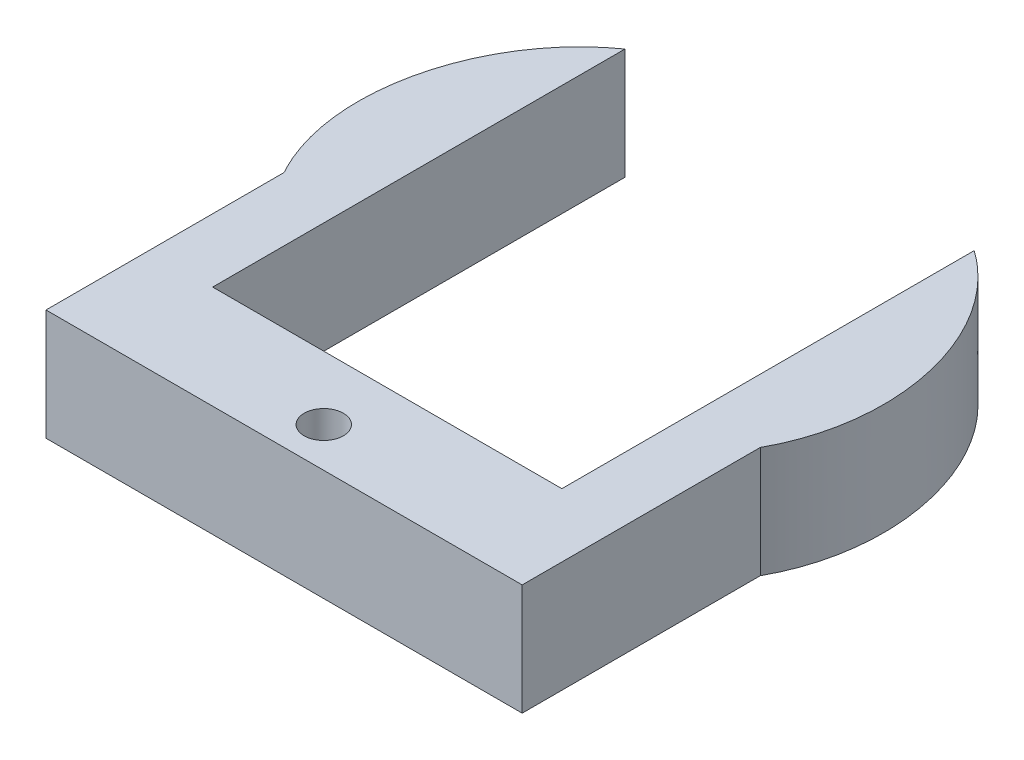
ISO-10303-21;
HEADER;
FILE_DESCRIPTION(('STEP AP214'),'2;1');
FILE_NAME('part.step','',(''),(''),'','','');
FILE_SCHEMA(('AUTOMOTIVE_DESIGN { 1 0 10303 214 1 1 1 1 }'));
ENDSEC;
DATA;
#1=APPLICATION_CONTEXT('core data for automotive mechanical design processes');
#2=APPLICATION_PROTOCOL_DEFINITION('international standard','automotive_design',2000,#1);
#3=PRODUCT_CONTEXT('',#1,'mechanical');
#4=PRODUCT('Part','Part','',(#3));
#5=PRODUCT_RELATED_PRODUCT_CATEGORY('part','',(#4));
#6=PRODUCT_DEFINITION_FORMATION('','',#4);
#7=PRODUCT_DEFINITION_CONTEXT('part definition',#1,'design');
#8=PRODUCT_DEFINITION('design','',#6,#7);
#9=PRODUCT_DEFINITION_SHAPE('','',#8);
#10=(LENGTH_UNIT() NAMED_UNIT(*) SI_UNIT(.MILLI.,.METRE.));
#11=(NAMED_UNIT(*) PLANE_ANGLE_UNIT() SI_UNIT($,.RADIAN.));
#12=(NAMED_UNIT(*) SI_UNIT($,.STERADIAN.) SOLID_ANGLE_UNIT());
#13=UNCERTAINTY_MEASURE_WITH_UNIT(LENGTH_MEASURE(1.E-05),#10,'distance_accuracy_value','');
#14=(GEOMETRIC_REPRESENTATION_CONTEXT(3) GLOBAL_UNCERTAINTY_ASSIGNED_CONTEXT((#13)) GLOBAL_UNIT_ASSIGNED_CONTEXT((#10,
#11,#12)) REPRESENTATION_CONTEXT('',''));
#15=CARTESIAN_POINT('',(0.,0.,0.));
#16=DIRECTION('',(0.,0.,1.));
#17=DIRECTION('',(1.,0.,0.));
#18=AXIS2_PLACEMENT_3D('',#15,#16,#17);
#19=CARTESIAN_POINT('',(0.,14.,-14.9999999999999));
#20=DIRECTION('',(0.,0.,-1.));
#21=DIRECTION('',(-1.,0.,0.));
#22=AXIS2_PLACEMENT_3D('',#19,#20,#21);
#23=PLANE('',#22);
#24=DIRECTION('',(1.,0.,0.));
#25=VECTOR('',#24,1.);
#26=CARTESIAN_POINT('',(0.,0.,-14.9999999999999));
#27=LINE('',#26,#25);
#28=CARTESIAN_POINT('',(0.,0.,-14.9999999999999));
#29=VERTEX_POINT('',#28);
#30=CARTESIAN_POINT('',(60.,0.,-14.9999999999999));
#31=VERTEX_POINT('',#30);
#32=EDGE_CURVE('E192',#29,#31,#27,.T.);
#33=ORIENTED_EDGE('',*,*,#32,.T.);
#34=DIRECTION('',(0.,-1.,0.));
#35=VECTOR('',#34,1.);
#36=CARTESIAN_POINT('',(60.,14.,-14.9999999999999));
#37=LINE('',#36,#35);
#38=CARTESIAN_POINT('',(60.,14.,-14.9999999999999));
#39=VERTEX_POINT('',#38);
#40=EDGE_CURVE('E11',#39,#31,#37,.T.);
#41=ORIENTED_EDGE('',*,*,#40,.F.);
#42=DIRECTION('',(1.,0.,0.));
#43=VECTOR('',#42,1.);
#44=CARTESIAN_POINT('',(0.,14.,-14.9999999999999));
#45=LINE('',#44,#43);
#46=CARTESIAN_POINT('',(0.,14.,-14.9999999999999));
#47=VERTEX_POINT('',#46);
#48=EDGE_CURVE('E209',#47,#39,#45,.T.);
#49=ORIENTED_EDGE('',*,*,#48,.F.);
#50=DIRECTION('',(0.,-1.,0.));
#51=VECTOR('',#50,1.);
#52=CARTESIAN_POINT('',(0.,14.,-14.9999999999999));
#53=LINE('',#52,#51);
#54=EDGE_CURVE('E124',#47,#29,#53,.T.);
#55=ORIENTED_EDGE('',*,*,#54,.T.);
#56=EDGE_LOOP('',(#33,#41,#49,#55));
#57=FACE_BOUND('',#56,.T.);
#58=ADVANCED_FACE('F33',(#57),#23,.F.);
#59=CARTESIAN_POINT('',(60.,14.,-14.9999999999999));
#60=DIRECTION('',(-1.,0.,0.));
#61=DIRECTION('',(0.,0.,1.));
#62=AXIS2_PLACEMENT_3D('',#59,#60,#61);
#63=PLANE('',#62);
#64=DIRECTION('',(0.,0.,-1.));
#65=VECTOR('',#64,1.);
#66=CARTESIAN_POINT('',(60.,0.,-14.9999999999999));
#67=LINE('',#66,#65);
#68=CARTESIAN_POINT('',(60.,0.,-45.));
#69=VERTEX_POINT('',#68);
#70=EDGE_CURVE('E189',#31,#69,#67,.T.);
#71=ORIENTED_EDGE('',*,*,#70,.T.);
#72=DIRECTION('',(0.,-1.,0.));
#73=VECTOR('',#72,1.);
#74=CARTESIAN_POINT('',(60.,14.,-45.));
#75=LINE('',#74,#73);
#76=CARTESIAN_POINT('',(60.,14.,-45.));
#77=VERTEX_POINT('',#76);
#78=EDGE_CURVE('E41',#77,#69,#75,.T.);
#79=ORIENTED_EDGE('',*,*,#78,.F.);
#80=DIRECTION('',(0.,0.,-1.));
#81=VECTOR('',#80,1.);
#82=CARTESIAN_POINT('',(60.,14.,-14.9999999999999));
#83=LINE('',#82,#81);
#84=EDGE_CURVE('E92',#39,#77,#83,.T.);
#85=ORIENTED_EDGE('',*,*,#84,.F.);
#86=ORIENTED_EDGE('',*,*,#40,.T.);
#87=EDGE_LOOP('',(#71,#79,#85,#86));
#88=FACE_BOUND('',#87,.T.);
#89=ADVANCED_FACE('F153',(#88),#63,.F.);
#90=CARTESIAN_POINT('',(60.,14.,-45.));
#91=CARTESIAN_POINT('',(64.2674134117202,14.,-52.7021578491893));
#92=CARTESIAN_POINT('',(63.8497104287764,14.,-67.2321104164456));
#93=CARTESIAN_POINT('',(55.427779911578,14.,-77.5248648328304));
#94=CARTESIAN_POINT('',(51.9999999999951,14.,-79.9540570080804));
#95=B_SPLINE_CURVE_WITH_KNOTS('',3,(#90,#91,#92,#93,#94),.UNSPECIFIED.,.F.,.F.,(4,1,4),(0.,
0.616858972813257,0.907352470321946),.UNSPECIFIED.);
#96=DIRECTION('',(0.,-1.,0.));
#97=VECTOR('',#96,1.);
#98=SURFACE_OF_LINEAR_EXTRUSION('',#95,#97);
#99=CARTESIAN_POINT('',(60.,0.,-45.));
#100=CARTESIAN_POINT('',(64.2674134117202,0.,-52.7021578491893));
#101=CARTESIAN_POINT('',(63.8497104287764,0.,-67.2321104164456));
#102=CARTESIAN_POINT('',(55.427779911578,0.,-77.5248648328304));
#103=CARTESIAN_POINT('',(51.9999999999951,0.,-79.9540570080804));
#104=B_SPLINE_CURVE_WITH_KNOTS('',3,(#99,#100,#101,#102,#103),.UNSPECIFIED.,.F.,.F.,(4,1,4),(0.,
0.616858972813257,0.907352470321946),.UNSPECIFIED.);
#105=CARTESIAN_POINT('',(51.999999999995,0.,-79.9540570080804));
#106=VERTEX_POINT('',#105);
#107=EDGE_CURVE('E185',#69,#106,#104,.T.);
#108=ORIENTED_EDGE('',*,*,#107,.T.);
#109=DIRECTION('',(0.,-1.,0.));
#110=VECTOR('',#109,1.);
#111=CARTESIAN_POINT('',(51.999999999995,14.,-79.9540570080804));
#112=LINE('',#111,#110);
#113=CARTESIAN_POINT('',(51.999999999995,14.,-79.9540570080804));
#114=VERTEX_POINT('',#113);
#115=EDGE_CURVE('E176',#114,#106,#112,.T.);
#116=ORIENTED_EDGE('',*,*,#115,.F.);
#117=EDGE_CURVE('E155',#77,#114,#95,.T.);
#118=ORIENTED_EDGE('',*,*,#117,.F.);
#119=ORIENTED_EDGE('',*,*,#78,.T.);
#120=EDGE_LOOP('',(#108,#116,#118,#119));
#121=FACE_BOUND('',#120,.T.);
#122=ADVANCED_FACE('F149',(#121),#98,.F.);
#123=CARTESIAN_POINT('',(51.999999999995,14.,-28.));
#124=DIRECTION('',(1.,0.,0.));
#125=DIRECTION('',(0.,0.,-1.));
#126=AXIS2_PLACEMENT_3D('',#123,#124,#125);
#127=PLANE('',#126);
#128=DIRECTION('',(0.,0.,1.));
#129=VECTOR('',#128,1.);
#130=CARTESIAN_POINT('',(51.999999999995,0.,-28.));
#131=LINE('',#130,#129);
#132=CARTESIAN_POINT('',(51.999999999995,0.,-28.));
#133=VERTEX_POINT('',#132);
#134=EDGE_CURVE('E173',#106,#133,#131,.T.);
#135=ORIENTED_EDGE('',*,*,#134,.T.);
#136=DIRECTION('',(0.,-1.,0.));
#137=VECTOR('',#136,1.);
#138=CARTESIAN_POINT('',(51.999999999995,14.,-28.));
#139=LINE('',#138,#137);
#140=CARTESIAN_POINT('',(51.999999999995,14.,-28.));
#141=VERTEX_POINT('',#140);
#142=EDGE_CURVE('E172',#141,#133,#139,.T.);
#143=ORIENTED_EDGE('',*,*,#142,.F.);
#144=DIRECTION('',(0.,0.,1.));
#145=VECTOR('',#144,1.);
#146=CARTESIAN_POINT('',(51.999999999995,14.,-70.29729534041));
#147=LINE('',#146,#145);
#148=EDGE_CURVE('E161',#114,#141,#147,.T.);
#149=ORIENTED_EDGE('',*,*,#148,.F.);
#150=ORIENTED_EDGE('',*,*,#115,.T.);
#151=EDGE_LOOP('',(#135,#143,#149,#150));
#152=FACE_BOUND('',#151,.T.);
#153=ADVANCED_FACE('F145',(#152),#127,.F.);
#154=CARTESIAN_POINT('',(8.00000000000495,14.,-28.));
#155=DIRECTION('',(0.,0.,1.));
#156=DIRECTION('',(1.,0.,0.));
#157=AXIS2_PLACEMENT_3D('',#154,#155,#156);
#158=PLANE('',#157);
#159=DIRECTION('',(-1.,0.,0.));
#160=VECTOR('',#159,1.);
#161=CARTESIAN_POINT('',(8.00000000000495,0.,-28.));
#162=LINE('',#161,#160);
#163=CARTESIAN_POINT('',(8.00000000000495,0.,-28.));
#164=VERTEX_POINT('',#163);
#165=EDGE_CURVE('E178',#133,#164,#162,.T.);
#166=ORIENTED_EDGE('',*,*,#165,.T.);
#167=DIRECTION('',(0.,-1.,0.));
#168=VECTOR('',#167,1.);
#169=CARTESIAN_POINT('',(8.00000000000495,14.,-28.));
#170=LINE('',#169,#168);
#171=CARTESIAN_POINT('',(8.00000000000495,14.,-28.));
#172=VERTEX_POINT('',#171);
#173=EDGE_CURVE('E119',#172,#164,#170,.T.);
#174=ORIENTED_EDGE('',*,*,#173,.F.);
#175=DIRECTION('',(-1.,0.,0.));
#176=VECTOR('',#175,1.);
#177=CARTESIAN_POINT('',(8.00000000000495,14.,-28.));
#178=LINE('',#177,#176);
#179=EDGE_CURVE('E111',#141,#172,#178,.T.);
#180=ORIENTED_EDGE('',*,*,#179,.F.);
#181=ORIENTED_EDGE('',*,*,#142,.T.);
#182=EDGE_LOOP('',(#166,#174,#180,#181));
#183=FACE_BOUND('',#182,.T.);
#184=ADVANCED_FACE('F142',(#183),#158,.F.);
#185=CARTESIAN_POINT('',(8.00000000000495,14.,-67.5014987303513));
#186=DIRECTION('',(-1.,0.,0.));
#187=DIRECTION('',(0.,0.,1.));
#188=AXIS2_PLACEMENT_3D('',#185,#186,#187);
#189=PLANE('',#188);
#190=DIRECTION('',(0.,0.,-1.));
#191=VECTOR('',#190,1.);
#192=CARTESIAN_POINT('',(8.00000000000495,0.,-67.5014987303513));
#193=LINE('',#192,#191);
#194=CARTESIAN_POINT('',(8.00000000000495,0.,-79.9540570080804));
#195=VERTEX_POINT('',#194);
#196=EDGE_CURVE('E118',#164,#195,#193,.T.);
#197=ORIENTED_EDGE('',*,*,#196,.T.);
#198=DIRECTION('',(0.,-1.,0.));
#199=VECTOR('',#198,1.);
#200=CARTESIAN_POINT('',(8.00000000000495,14.,-79.9540570080804));
#201=LINE('',#200,#199);
#202=CARTESIAN_POINT('',(8.00000000000495,14.,-79.9540570080804));
#203=VERTEX_POINT('',#202);
#204=EDGE_CURVE('E116',#203,#195,#201,.T.);
#205=ORIENTED_EDGE('',*,*,#204,.F.);
#206=DIRECTION('',(0.,0.,-1.));
#207=VECTOR('',#206,1.);
#208=CARTESIAN_POINT('',(8.00000000000495,14.,-28.));
#209=LINE('',#208,#207);
#210=EDGE_CURVE('E105',#172,#203,#209,.T.);
#211=ORIENTED_EDGE('',*,*,#210,.F.);
#212=ORIENTED_EDGE('',*,*,#173,.T.);
#213=EDGE_LOOP('',(#197,#205,#211,#212));
#214=FACE_BOUND('',#213,.T.);
#215=ADVANCED_FACE('F117',(#214),#189,.F.);
#216=CARTESIAN_POINT('',(8.00000000000495,14.,-79.9540570080804));
#217=CARTESIAN_POINT('',(4.57222008842203,14.,-77.5248648328304));
#218=CARTESIAN_POINT('',(-3.8497104287764,14.,-67.2321104164456));
#219=CARTESIAN_POINT('',(-4.2674134117202,14.,-52.7021578491893));
#220=CARTESIAN_POINT('',(0.,14.,-45.));
#221=B_SPLINE_CURVE_WITH_KNOTS('',3,(#216,#217,#218,#219,#220),.UNSPECIFIED.,.F.,.F.,(4,1,4),
(0.,0.290493497508689,0.907352470321946),.UNSPECIFIED.);
#222=DIRECTION('',(0.,-1.,0.));
#223=VECTOR('',#222,1.);
#224=SURFACE_OF_LINEAR_EXTRUSION('',#221,#223);
#225=CARTESIAN_POINT('',(8.00000000000495,0.,-79.9540570080804));
#226=CARTESIAN_POINT('',(4.57222008842203,0.,-77.5248648328304));
#227=CARTESIAN_POINT('',(-3.8497104287764,0.,-67.2321104164456));
#228=CARTESIAN_POINT('',(-4.2674134117202,0.,-52.7021578491893));
#229=CARTESIAN_POINT('',(0.,0.,-45.));
#230=B_SPLINE_CURVE_WITH_KNOTS('',3,(#225,#226,#227,#228,#229),.UNSPECIFIED.,.F.,.F.,(4,1,4),
(0.,0.290493497508689,0.907352470321946),.UNSPECIFIED.);
#231=CARTESIAN_POINT('',(0.,0.,-45.));
#232=VERTEX_POINT('',#231);
#233=EDGE_CURVE('E78',#195,#232,#230,.T.);
#234=ORIENTED_EDGE('',*,*,#233,.T.);
#235=DIRECTION('',(0.,-1.,0.));
#236=VECTOR('',#235,1.);
#237=CARTESIAN_POINT('',(0.,14.,-45.));
#238=LINE('',#237,#236);
#239=CARTESIAN_POINT('',(0.,14.,-45.));
#240=VERTEX_POINT('',#239);
#241=EDGE_CURVE('E120',#240,#232,#238,.T.);
#242=ORIENTED_EDGE('',*,*,#241,.F.);
#243=EDGE_CURVE('E109',#203,#240,#221,.T.);
#244=ORIENTED_EDGE('',*,*,#243,.F.);
#245=ORIENTED_EDGE('',*,*,#204,.T.);
#246=EDGE_LOOP('',(#234,#242,#244,#245));
#247=FACE_BOUND('',#246,.T.);
#248=ADVANCED_FACE('F122',(#247),#224,.F.);
#249=CARTESIAN_POINT('',(0.,14.,-45.));
#250=DIRECTION('',(1.,0.,0.));
#251=DIRECTION('',(0.,0.,-1.));
#252=AXIS2_PLACEMENT_3D('',#249,#250,#251);
#253=PLANE('',#252);
#254=DIRECTION('',(0.,0.,1.));
#255=VECTOR('',#254,1.);
#256=CARTESIAN_POINT('',(0.,0.,-45.));
#257=LINE('',#256,#255);
#258=EDGE_CURVE('E84',#232,#29,#257,.T.);
#259=ORIENTED_EDGE('',*,*,#258,.T.);
#260=ORIENTED_EDGE('',*,*,#54,.F.);
#261=DIRECTION('',(0.,0.,1.));
#262=VECTOR('',#261,1.);
#263=CARTESIAN_POINT('',(0.,14.,-45.));
#264=LINE('',#263,#262);
#265=EDGE_CURVE('E49',#240,#47,#264,.T.);
#266=ORIENTED_EDGE('',*,*,#265,.F.);
#267=ORIENTED_EDGE('',*,*,#241,.T.);
#268=EDGE_LOOP('',(#259,#260,#266,#267));
#269=FACE_BOUND('',#268,.T.);
#270=ADVANCED_FACE('F138',(#269),#253,.F.);
#271=CARTESIAN_POINT('',(62.3688736842716,14.,-63.8801801787169));
#272=DIRECTION('',(0.,-1.,0.));
#273=DIRECTION('',(0.,0.,-1.));
#274=AXIS2_PLACEMENT_3D('',#271,#272,#273);
#275=PLANE('',#274);
#276=CARTESIAN_POINT('',(30.,14.,-20.));
#277=DIRECTION('',(0.,-1.,0.));
#278=DIRECTION('',(0.,0.,-1.));
#279=AXIS2_PLACEMENT_3D('',#276,#277,#278);
#280=CIRCLE('',#279,2.46971811595379);
#281=CARTESIAN_POINT('',(30.,14.,-22.4697181159538));
#282=VERTEX_POINT('',#281);
#283=EDGE_CURVE('E213',#282,#282,#280,.T.);
#284=ORIENTED_EDGE('',*,*,#283,.T.);
#285=EDGE_LOOP('',(#284));
#286=FACE_BOUND('',#285,.T.);
#287=ORIENTED_EDGE('',*,*,#48,.T.);
#288=ORIENTED_EDGE('',*,*,#84,.T.);
#289=ORIENTED_EDGE('',*,*,#117,.T.);
#290=ORIENTED_EDGE('',*,*,#148,.T.);
#291=ORIENTED_EDGE('',*,*,#179,.T.);
#292=ORIENTED_EDGE('',*,*,#210,.T.);
#293=ORIENTED_EDGE('',*,*,#243,.T.);
#294=ORIENTED_EDGE('',*,*,#265,.T.);
#295=EDGE_LOOP('',(#287,#288,#289,#290,#291,#292,#293,#294));
#296=FACE_BOUND('',#295,.T.);
#297=ADVANCED_FACE('F107',(#286,#296),#275,.F.);
#298=CARTESIAN_POINT('',(62.3688736842716,0.,-63.8801801787169));
#299=DIRECTION('',(0.,-1.,0.));
#300=DIRECTION('',(0.,0.,-1.));
#301=AXIS2_PLACEMENT_3D('',#298,#299,#300);
#302=PLANE('',#301);
#303=CARTESIAN_POINT('',(30.,0.,-20.));
#304=DIRECTION('',(0.,-1.,0.));
#305=DIRECTION('',(0.,0.,-1.));
#306=AXIS2_PLACEMENT_3D('',#303,#304,#305);
#307=CIRCLE('',#306,2.46971811595379);
#308=CARTESIAN_POINT('',(30.,0.,-22.4697181159538));
#309=VERTEX_POINT('',#308);
#310=EDGE_CURVE('E215',#309,#309,#307,.T.);
#311=ORIENTED_EDGE('',*,*,#310,.F.);
#312=EDGE_LOOP('',(#311));
#313=FACE_BOUND('',#312,.T.);
#314=ORIENTED_EDGE('',*,*,#32,.F.);
#315=ORIENTED_EDGE('',*,*,#258,.F.);
#316=ORIENTED_EDGE('',*,*,#233,.F.);
#317=ORIENTED_EDGE('',*,*,#196,.F.);
#318=ORIENTED_EDGE('',*,*,#165,.F.);
#319=ORIENTED_EDGE('',*,*,#134,.F.);
#320=ORIENTED_EDGE('',*,*,#107,.F.);
#321=ORIENTED_EDGE('',*,*,#70,.F.);
#322=EDGE_LOOP('',(#314,#315,#316,#317,#318,#319,#320,#321));
#323=FACE_BOUND('',#322,.T.);
#324=ADVANCED_FACE('F188',(#313,#323),#302,.T.);
#325=CARTESIAN_POINT('',(30.,21.,-20.));
#326=DIRECTION('',(0.,-1.,0.));
#327=DIRECTION('',(0.,0.,-1.));
#328=AXIS2_PLACEMENT_3D('',#325,#326,#327);
#329=CYLINDRICAL_SURFACE('',#328,2.46971811595379);
#330=ORIENTED_EDGE('',*,*,#310,.T.);
#331=EDGE_LOOP('',(#330));
#332=FACE_BOUND('',#331,.T.);
#333=ORIENTED_EDGE('',*,*,#283,.F.);
#334=EDGE_LOOP('',(#333));
#335=FACE_BOUND('',#334,.T.);
#336=ADVANCED_FACE('F288',(#332,#335),#329,.F.);
#337=CLOSED_SHELL('',(#58,#89,#122,#153,#184,#215,#248,#270,#297,#324,#336));
#338=MANIFOLD_SOLID_BREP('B2',#337);
#339=ADVANCED_BREP_SHAPE_REPRESENTATION('',(#18,#338),#14);
#340=SHAPE_DEFINITION_REPRESENTATION(#9,#339);
ENDSEC;
END-ISO-10303-21;
